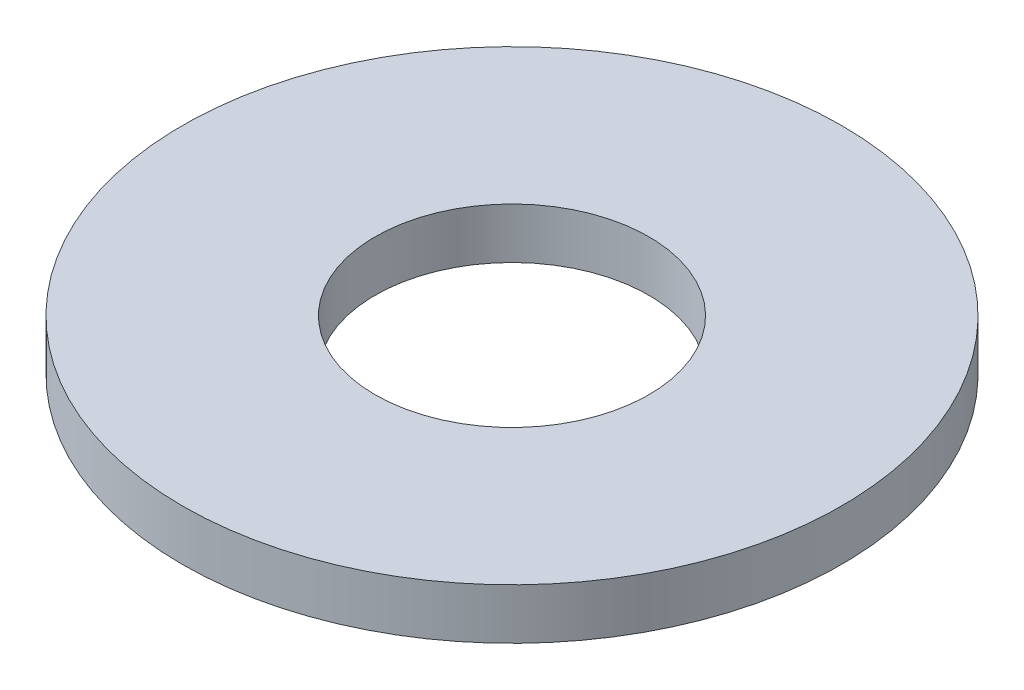
ISO-10303-21;
HEADER;
FILE_DESCRIPTION(('STEP AP214'),'2;1');
FILE_NAME('part.step','',(''),(''),'','','');
FILE_SCHEMA(('AUTOMOTIVE_DESIGN { 1 0 10303 214 1 1 1 1 }'));
ENDSEC;
DATA;
#1=APPLICATION_CONTEXT('core data for automotive mechanical design processes');
#2=APPLICATION_PROTOCOL_DEFINITION('international standard','automotive_design',2000,#1);
#3=PRODUCT_CONTEXT('',#1,'mechanical');
#4=PRODUCT('Part','Part','',(#3));
#5=PRODUCT_RELATED_PRODUCT_CATEGORY('part','',(#4));
#6=PRODUCT_DEFINITION_FORMATION('','',#4);
#7=PRODUCT_DEFINITION_CONTEXT('part definition',#1,'design');
#8=PRODUCT_DEFINITION('design','',#6,#7);
#9=PRODUCT_DEFINITION_SHAPE('','',#8);
#10=(LENGTH_UNIT() NAMED_UNIT(*) SI_UNIT(.MILLI.,.METRE.));
#11=(NAMED_UNIT(*) PLANE_ANGLE_UNIT() SI_UNIT($,.RADIAN.));
#12=(NAMED_UNIT(*) SI_UNIT($,.STERADIAN.) SOLID_ANGLE_UNIT());
#13=UNCERTAINTY_MEASURE_WITH_UNIT(LENGTH_MEASURE(1.E-05),#10,'distance_accuracy_value','');
#14=(GEOMETRIC_REPRESENTATION_CONTEXT(3) GLOBAL_UNCERTAINTY_ASSIGNED_CONTEXT((#13)) GLOBAL_UNIT_ASSIGNED_CONTEXT((#10,
#11,#12)) REPRESENTATION_CONTEXT('',''));
#15=CARTESIAN_POINT('',(0.,0.,0.));
#16=DIRECTION('',(0.,0.,1.));
#17=DIRECTION('',(1.,0.,0.));
#18=AXIS2_PLACEMENT_3D('',#15,#16,#17);
#19=CARTESIAN_POINT('',(0.,0.25,0.));
#20=DIRECTION('',(0.,1.,0.));
#21=DIRECTION('',(0.,0.,1.));
#22=AXIS2_PLACEMENT_3D('',#19,#20,#21);
#23=PLANE('',#22);
#24=CARTESIAN_POINT('',(0.,0.25,0.));
#25=DIRECTION('',(0.,1.,0.));
#26=DIRECTION('',(0.,0.,1.));
#27=AXIS2_PLACEMENT_3D('',#24,#25,#26);
#28=CIRCLE('',#27,3.25);
#29=CARTESIAN_POINT('',(0.,0.25,3.25));
#30=VERTEX_POINT('',#29);
#31=EDGE_CURVE('E10',#30,#30,#28,.T.);
#32=ORIENTED_EDGE('',*,*,#31,.T.);
#33=EDGE_LOOP('',(#32));
#34=FACE_BOUND('',#33,.T.);
#35=CARTESIAN_POINT('',(0.,0.25,0.));
#36=DIRECTION('',(0.,1.,0.));
#37=DIRECTION('',(0.,0.,1.));
#38=AXIS2_PLACEMENT_3D('',#35,#36,#37);
#39=CIRCLE('',#38,1.35);
#40=CARTESIAN_POINT('',(0.,0.25,1.35));
#41=VERTEX_POINT('',#40);
#42=EDGE_CURVE('E43',#41,#41,#39,.T.);
#43=ORIENTED_EDGE('',*,*,#42,.F.);
#44=EDGE_LOOP('',(#43));
#45=FACE_BOUND('',#44,.T.);
#46=ADVANCED_FACE('F32',(#34,#45),#23,.T.);
#47=CARTESIAN_POINT('',(0.,-0.25,0.));
#48=DIRECTION('',(0.,1.,0.));
#49=DIRECTION('',(0.,0.,1.));
#50=AXIS2_PLACEMENT_3D('',#47,#48,#49);
#51=PLANE('',#50);
#52=CARTESIAN_POINT('',(0.,-0.25,0.));
#53=DIRECTION('',(0.,1.,0.));
#54=DIRECTION('',(0.,0.,1.));
#55=AXIS2_PLACEMENT_3D('',#52,#53,#54);
#56=CIRCLE('',#55,3.25);
#57=CARTESIAN_POINT('',(0.,-0.25,3.25));
#58=VERTEX_POINT('',#57);
#59=EDGE_CURVE('E36',#58,#58,#56,.T.);
#60=ORIENTED_EDGE('',*,*,#59,.F.);
#61=EDGE_LOOP('',(#60));
#62=FACE_BOUND('',#61,.T.);
#63=CARTESIAN_POINT('',(0.,-0.25,0.));
#64=DIRECTION('',(0.,1.,0.));
#65=DIRECTION('',(0.,0.,1.));
#66=AXIS2_PLACEMENT_3D('',#63,#64,#65);
#67=CIRCLE('',#66,1.35);
#68=CARTESIAN_POINT('',(0.,-0.25,1.35));
#69=VERTEX_POINT('',#68);
#70=EDGE_CURVE('E45',#69,#69,#67,.T.);
#71=ORIENTED_EDGE('',*,*,#70,.T.);
#72=EDGE_LOOP('',(#71));
#73=FACE_BOUND('',#72,.T.);
#74=ADVANCED_FACE('F55',(#62,#73),#51,.F.);
#75=CARTESIAN_POINT('',(0.,0.25,0.));
#76=DIRECTION('',(0.,-1.,0.));
#77=DIRECTION('',(0.,0.,-1.));
#78=AXIS2_PLACEMENT_3D('',#75,#76,#77);
#79=CYLINDRICAL_SURFACE('',#78,3.25);
#80=ORIENTED_EDGE('',*,*,#31,.F.);
#81=EDGE_LOOP('',(#80));
#82=FACE_BOUND('',#81,.T.);
#83=ORIENTED_EDGE('',*,*,#59,.T.);
#84=EDGE_LOOP('',(#83));
#85=FACE_BOUND('',#84,.T.);
#86=ADVANCED_FACE('F34',(#82,#85),#79,.T.);
#87=CARTESIAN_POINT('',(0.,0.25,0.));
#88=DIRECTION('',(0.,-1.,0.));
#89=DIRECTION('',(0.,0.,-1.));
#90=AXIS2_PLACEMENT_3D('',#87,#88,#89);
#91=CYLINDRICAL_SURFACE('',#90,1.35);
#92=ORIENTED_EDGE('',*,*,#42,.T.);
#93=EDGE_LOOP('',(#92));
#94=FACE_BOUND('',#93,.T.);
#95=ORIENTED_EDGE('',*,*,#70,.F.);
#96=EDGE_LOOP('',(#95));
#97=FACE_BOUND('',#96,.T.);
#98=ADVANCED_FACE('F51',(#94,#97),#91,.F.);
#99=CLOSED_SHELL('',(#46,#74,#86,#98));
#100=MANIFOLD_SOLID_BREP('B2',#99);
#101=ADVANCED_BREP_SHAPE_REPRESENTATION('',(#18,#100),#14);
#102=SHAPE_DEFINITION_REPRESENTATION(#9,#101);
ENDSEC;
END-ISO-10303-21;
